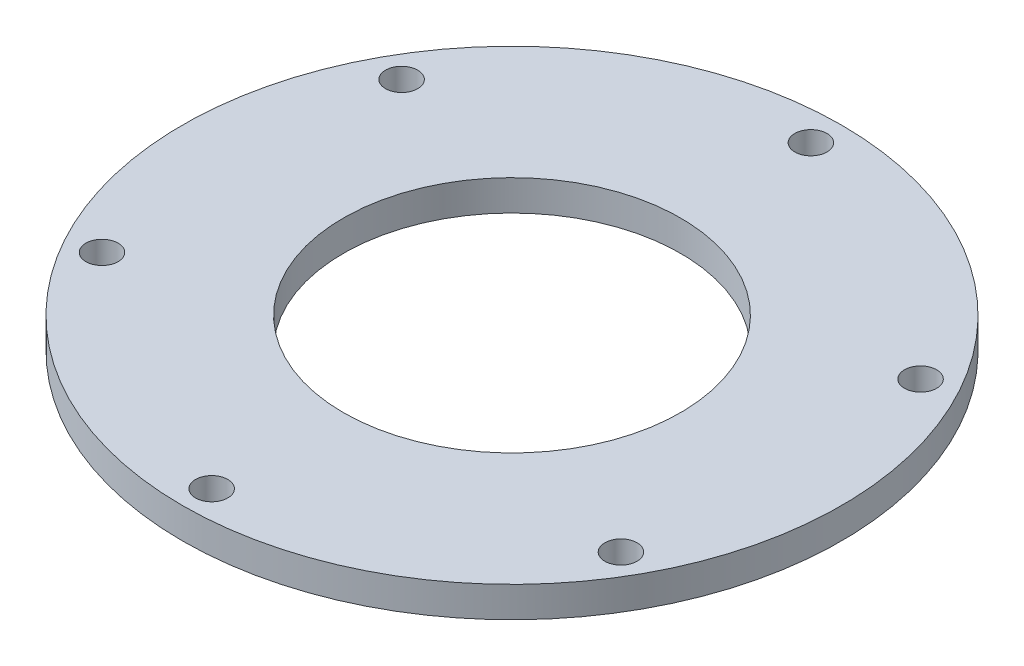
ISO-10303-21;
HEADER;
FILE_DESCRIPTION(('STEP AP214'),'2;1');
FILE_NAME('part.step','',(''),(''),'','','');
FILE_SCHEMA(('AUTOMOTIVE_DESIGN { 1 0 10303 214 1 1 1 1 }'));
ENDSEC;
DATA;
#1=APPLICATION_CONTEXT('core data for automotive mechanical design processes');
#2=APPLICATION_PROTOCOL_DEFINITION('international standard','automotive_design',2000,#1);
#3=PRODUCT_CONTEXT('',#1,'mechanical');
#4=PRODUCT('Part','Part','',(#3));
#5=PRODUCT_RELATED_PRODUCT_CATEGORY('part','',(#4));
#6=PRODUCT_DEFINITION_FORMATION('','',#4);
#7=PRODUCT_DEFINITION_CONTEXT('part definition',#1,'design');
#8=PRODUCT_DEFINITION('design','',#6,#7);
#9=PRODUCT_DEFINITION_SHAPE('','',#8);
#10=(LENGTH_UNIT() NAMED_UNIT(*) SI_UNIT(.MILLI.,.METRE.));
#11=(NAMED_UNIT(*) PLANE_ANGLE_UNIT() SI_UNIT($,.RADIAN.));
#12=(NAMED_UNIT(*) SI_UNIT($,.STERADIAN.) SOLID_ANGLE_UNIT());
#13=UNCERTAINTY_MEASURE_WITH_UNIT(LENGTH_MEASURE(1.E-05),#10,'distance_accuracy_value','');
#14=(GEOMETRIC_REPRESENTATION_CONTEXT(3) GLOBAL_UNCERTAINTY_ASSIGNED_CONTEXT((#13)) GLOBAL_UNIT_ASSIGNED_CONTEXT((#10,
#11,#12)) REPRESENTATION_CONTEXT('',''));
#15=CARTESIAN_POINT('',(0.,0.,0.));
#16=DIRECTION('',(0.,0.,1.));
#17=DIRECTION('',(1.,0.,0.));
#18=AXIS2_PLACEMENT_3D('',#15,#16,#17);
#19=CARTESIAN_POINT('',(0.,10.,0.));
#20=DIRECTION('',(0.,-1.,0.));
#21=DIRECTION('',(0.,0.,-1.));
#22=AXIS2_PLACEMENT_3D('',#19,#20,#21);
#23=CYLINDRICAL_SURFACE('',#22,107.5);
#24=CARTESIAN_POINT('',(0.,10.,0.));
#25=DIRECTION('',(0.,1.,0.));
#26=DIRECTION('',(0.,0.,1.));
#27=AXIS2_PLACEMENT_3D('',#24,#25,#26);
#28=CIRCLE('',#27,107.5);
#29=CARTESIAN_POINT('',(0.,10.,107.5));
#30=VERTEX_POINT('',#29);
#31=EDGE_CURVE('E10',#30,#30,#28,.T.);
#32=ORIENTED_EDGE('',*,*,#31,.F.);
#33=EDGE_LOOP('',(#32));
#34=FACE_BOUND('',#33,.T.);
#35=CARTESIAN_POINT('',(0.,0.,0.));
#36=DIRECTION('',(0.,1.,0.));
#37=DIRECTION('',(0.,0.,1.));
#38=AXIS2_PLACEMENT_3D('',#35,#36,#37);
#39=CIRCLE('',#38,107.5);
#40=CARTESIAN_POINT('',(0.,0.,107.5));
#41=VERTEX_POINT('',#40);
#42=EDGE_CURVE('E45',#41,#41,#39,.T.);
#43=ORIENTED_EDGE('',*,*,#42,.T.);
#44=EDGE_LOOP('',(#43));
#45=FACE_BOUND('',#44,.T.);
#46=ADVANCED_FACE('F37',(#34,#45),#23,.T.);
#47=CARTESIAN_POINT('',(0.,10.,0.));
#48=DIRECTION('',(0.,1.,0.));
#49=DIRECTION('',(0.,0.,1.));
#50=AXIS2_PLACEMENT_3D('',#47,#48,#49);
#51=PLANE('',#50);
#52=CARTESIAN_POINT('',(0.,10.,0.));
#53=DIRECTION('',(0.,1.,0.));
#54=DIRECTION('',(0.,0.,1.));
#55=AXIS2_PLACEMENT_3D('',#52,#53,#54);
#56=CIRCLE('',#55,55.);
#57=CARTESIAN_POINT('',(0.,10.,55.));
#58=VERTEX_POINT('',#57);
#59=EDGE_CURVE('E213',#58,#58,#56,.T.);
#60=ORIENTED_EDGE('',*,*,#59,.F.);
#61=EDGE_LOOP('',(#60));
#62=FACE_BOUND('',#61,.T.);
#63=CARTESIAN_POINT('',(84.6393478934333,10.,-48.6334497096926));
#64=DIRECTION('',(0.,1.,0.));
#65=DIRECTION('',(0.,0.,1.));
#66=AXIS2_PLACEMENT_3D('',#63,#64,#65);
#67=CIRCLE('',#66,5.24999999999999);
#68=CARTESIAN_POINT('',(84.6393478934333,10.,-43.3834497096926));
#69=VERTEX_POINT('',#68);
#70=EDGE_CURVE('E90',#69,#69,#67,.T.);
#71=ORIENTED_EDGE('',*,*,#70,.F.);
#72=EDGE_LOOP('',(#71));
#73=FACE_BOUND('',#72,.T.);
#74=CARTESIAN_POINT('',(84.6393478934343,10.,49.0996508709245));
#75=DIRECTION('',(0.,1.,0.));
#76=DIRECTION('',(0.,0.,1.));
#77=AXIS2_PLACEMENT_3D('',#74,#75,#76);
#78=CIRCLE('',#77,5.24999999999999);
#79=CARTESIAN_POINT('',(84.6393478934343,10.,54.3496508709244));
#80=VERTEX_POINT('',#79);
#81=EDGE_CURVE('E77',#80,#80,#78,.T.);
#82=ORIENTED_EDGE('',*,*,#81,.F.);
#83=EDGE_LOOP('',(#82));
#84=FACE_BOUND('',#83,.T.);
#85=CARTESIAN_POINT('',(0.,10.,97.9662011612337));
#86=DIRECTION('',(0.,1.,0.));
#87=DIRECTION('',(0.,0.,1.));
#88=AXIS2_PLACEMENT_3D('',#85,#86,#87);
#89=CIRCLE('',#88,5.25);
#90=CARTESIAN_POINT('',(0.,10.,103.216201161234));
#91=VERTEX_POINT('',#90);
#92=EDGE_CURVE('E73',#91,#91,#89,.T.);
#93=ORIENTED_EDGE('',*,*,#92,.F.);
#94=EDGE_LOOP('',(#93));
#95=FACE_BOUND('',#94,.T.);
#96=CARTESIAN_POINT('',(-84.6393478934336,10.,49.0996508709257));
#97=DIRECTION('',(0.,1.,0.));
#98=DIRECTION('',(0.,0.,1.));
#99=AXIS2_PLACEMENT_3D('',#96,#97,#98);
#100=CIRCLE('',#99,5.24999999999999);
#101=CARTESIAN_POINT('',(-84.6393478934336,10.,54.3496508709256));
#102=VERTEX_POINT('',#101);
#103=EDGE_CURVE('E69',#102,#102,#100,.T.);
#104=ORIENTED_EDGE('',*,*,#103,.F.);
#105=EDGE_LOOP('',(#104));
#106=FACE_BOUND('',#105,.T.);
#107=CARTESIAN_POINT('',(-84.6393478934339,10.,-48.6334497096914));
#108=DIRECTION('',(0.,1.,0.));
#109=DIRECTION('',(0.,0.,1.));
#110=AXIS2_PLACEMENT_3D('',#107,#108,#109);
#111=CIRCLE('',#110,5.24999999999999);
#112=CARTESIAN_POINT('',(-84.6393478934339,10.,-43.3834497096914));
#113=VERTEX_POINT('',#112);
#114=EDGE_CURVE('E64',#113,#113,#111,.T.);
#115=ORIENTED_EDGE('',*,*,#114,.F.);
#116=EDGE_LOOP('',(#115));
#117=FACE_BOUND('',#116,.T.);
#118=CARTESIAN_POINT('',(0.,10.,-97.5));
#119=DIRECTION('',(0.,1.,0.));
#120=DIRECTION('',(0.,0.,1.));
#121=AXIS2_PLACEMENT_3D('',#118,#119,#120);
#122=CIRCLE('',#121,5.25);
#123=CARTESIAN_POINT('',(0.,10.,-92.25));
#124=VERTEX_POINT('',#123);
#125=EDGE_CURVE('E54',#124,#124,#122,.T.);
#126=ORIENTED_EDGE('',*,*,#125,.F.);
#127=EDGE_LOOP('',(#126));
#128=FACE_BOUND('',#127,.T.);
#129=ORIENTED_EDGE('',*,*,#31,.T.);
#130=EDGE_LOOP('',(#129));
#131=FACE_BOUND('',#130,.T.);
#132=ADVANCED_FACE('F103',(#62,#73,#84,#95,#106,#117,#128,#131),#51,.T.);
#133=CARTESIAN_POINT('',(0.,0.,0.));
#134=DIRECTION('',(0.,1.,0.));
#135=DIRECTION('',(0.,0.,1.));
#136=AXIS2_PLACEMENT_3D('',#133,#134,#135);
#137=PLANE('',#136);
#138=CARTESIAN_POINT('',(0.,0.,0.));
#139=DIRECTION('',(0.,1.,0.));
#140=DIRECTION('',(0.,0.,1.));
#141=AXIS2_PLACEMENT_3D('',#138,#139,#140);
#142=CIRCLE('',#141,55.);
#143=CARTESIAN_POINT('',(0.,0.,55.));
#144=VERTEX_POINT('',#143);
#145=EDGE_CURVE('E210',#144,#144,#142,.T.);
#146=ORIENTED_EDGE('',*,*,#145,.T.);
#147=EDGE_LOOP('',(#146));
#148=FACE_BOUND('',#147,.T.);
#149=CARTESIAN_POINT('',(84.6393478934333,0.,-48.6334497096926));
#150=DIRECTION('',(0.,1.,0.));
#151=DIRECTION('',(0.,0.,1.));
#152=AXIS2_PLACEMENT_3D('',#149,#150,#151);
#153=CIRCLE('',#152,5.24999999999999);
#154=CARTESIAN_POINT('',(84.6393478934333,0.,-43.3834497096926));
#155=VERTEX_POINT('',#154);
#156=EDGE_CURVE('E40',#155,#155,#153,.T.);
#157=ORIENTED_EDGE('',*,*,#156,.T.);
#158=EDGE_LOOP('',(#157));
#159=FACE_BOUND('',#158,.T.);
#160=CARTESIAN_POINT('',(84.6393478934343,0.,49.0996508709245));
#161=DIRECTION('',(0.,1.,0.));
#162=DIRECTION('',(0.,0.,1.));
#163=AXIS2_PLACEMENT_3D('',#160,#161,#162);
#164=CIRCLE('',#163,5.24999999999999);
#165=CARTESIAN_POINT('',(84.6393478934343,0.,54.3496508709244));
#166=VERTEX_POINT('',#165);
#167=EDGE_CURVE('E74',#166,#166,#164,.T.);
#168=ORIENTED_EDGE('',*,*,#167,.T.);
#169=EDGE_LOOP('',(#168));
#170=FACE_BOUND('',#169,.T.);
#171=CARTESIAN_POINT('',(0.,0.,97.9662011612337));
#172=DIRECTION('',(0.,1.,0.));
#173=DIRECTION('',(0.,0.,1.));
#174=AXIS2_PLACEMENT_3D('',#171,#172,#173);
#175=CIRCLE('',#174,5.24999999999999);
#176=CARTESIAN_POINT('',(0.,0.,103.216201161234));
#177=VERTEX_POINT('',#176);
#178=EDGE_CURVE('E70',#177,#177,#175,.T.);
#179=ORIENTED_EDGE('',*,*,#178,.T.);
#180=EDGE_LOOP('',(#179));
#181=FACE_BOUND('',#180,.T.);
#182=CARTESIAN_POINT('',(-84.6393478934336,0.,49.0996508709257));
#183=DIRECTION('',(0.,1.,0.));
#184=DIRECTION('',(0.,0.,1.));
#185=AXIS2_PLACEMENT_3D('',#182,#183,#184);
#186=CIRCLE('',#185,5.24999999999999);
#187=CARTESIAN_POINT('',(-84.6393478934336,0.,54.3496508709256));
#188=VERTEX_POINT('',#187);
#189=EDGE_CURVE('E65',#188,#188,#186,.T.);
#190=ORIENTED_EDGE('',*,*,#189,.T.);
#191=EDGE_LOOP('',(#190));
#192=FACE_BOUND('',#191,.T.);
#193=CARTESIAN_POINT('',(-84.6393478934339,0.,-48.6334497096914));
#194=DIRECTION('',(0.,1.,0.));
#195=DIRECTION('',(0.,0.,1.));
#196=AXIS2_PLACEMENT_3D('',#193,#194,#195);
#197=CIRCLE('',#196,5.24999999999999);
#198=CARTESIAN_POINT('',(-84.6393478934339,0.,-43.3834497096914));
#199=VERTEX_POINT('',#198);
#200=EDGE_CURVE('E60',#199,#199,#197,.T.);
#201=ORIENTED_EDGE('',*,*,#200,.T.);
#202=EDGE_LOOP('',(#201));
#203=FACE_BOUND('',#202,.T.);
#204=CARTESIAN_POINT('',(0.,0.,-97.5));
#205=DIRECTION('',(0.,1.,0.));
#206=DIRECTION('',(0.,0.,1.));
#207=AXIS2_PLACEMENT_3D('',#204,#205,#206);
#208=CIRCLE('',#207,5.24999999999999);
#209=CARTESIAN_POINT('',(0.,0.,-92.25));
#210=VERTEX_POINT('',#209);
#211=EDGE_CURVE('E51',#210,#210,#208,.T.);
#212=ORIENTED_EDGE('',*,*,#211,.T.);
#213=EDGE_LOOP('',(#212));
#214=FACE_BOUND('',#213,.T.);
#215=ORIENTED_EDGE('',*,*,#42,.F.);
#216=EDGE_LOOP('',(#215));
#217=FACE_BOUND('',#216,.T.);
#218=ADVANCED_FACE('F106',(#148,#159,#170,#181,#192,#203,#214,#217),#137,.F.);
#219=CARTESIAN_POINT('',(0.,10.,-97.5));
#220=DIRECTION('',(0.,1.,0.));
#221=DIRECTION('',(0.,0.,1.));
#222=AXIS2_PLACEMENT_3D('',#219,#220,#221);
#223=CYLINDRICAL_SURFACE('',#222,5.24999999999999);
#224=ORIENTED_EDGE('',*,*,#125,.T.);
#225=EDGE_LOOP('',(#224));
#226=FACE_BOUND('',#225,.T.);
#227=ORIENTED_EDGE('',*,*,#211,.F.);
#228=EDGE_LOOP('',(#227));
#229=FACE_BOUND('',#228,.T.);
#230=ADVANCED_FACE('F113',(#226,#229),#223,.F.);
#231=CARTESIAN_POINT('',(-84.6393478934339,10.,-48.6334497096914));
#232=DIRECTION('',(0.,1.,0.));
#233=DIRECTION('',(0.,0.,1.));
#234=AXIS2_PLACEMENT_3D('',#231,#232,#233);
#235=CYLINDRICAL_SURFACE('',#234,5.24999999999999);
#236=ORIENTED_EDGE('',*,*,#114,.T.);
#237=EDGE_LOOP('',(#236));
#238=FACE_BOUND('',#237,.T.);
#239=ORIENTED_EDGE('',*,*,#200,.F.);
#240=EDGE_LOOP('',(#239));
#241=FACE_BOUND('',#240,.T.);
#242=ADVANCED_FACE('F100',(#238,#241),#235,.F.);
#243=CARTESIAN_POINT('',(-84.6393478934336,10.,49.0996508709257));
#244=DIRECTION('',(0.,1.,0.));
#245=DIRECTION('',(0.,0.,1.));
#246=AXIS2_PLACEMENT_3D('',#243,#244,#245);
#247=CYLINDRICAL_SURFACE('',#246,5.24999999999999);
#248=ORIENTED_EDGE('',*,*,#103,.T.);
#249=EDGE_LOOP('',(#248));
#250=FACE_BOUND('',#249,.T.);
#251=ORIENTED_EDGE('',*,*,#189,.F.);
#252=EDGE_LOOP('',(#251));
#253=FACE_BOUND('',#252,.T.);
#254=ADVANCED_FACE('F148',(#250,#253),#247,.F.);
#255=CARTESIAN_POINT('',(0.,10.,97.9662011612337));
#256=DIRECTION('',(0.,1.,0.));
#257=DIRECTION('',(0.,0.,1.));
#258=AXIS2_PLACEMENT_3D('',#255,#256,#257);
#259=CYLINDRICAL_SURFACE('',#258,5.24999999999999);
#260=ORIENTED_EDGE('',*,*,#92,.T.);
#261=EDGE_LOOP('',(#260));
#262=FACE_BOUND('',#261,.T.);
#263=ORIENTED_EDGE('',*,*,#178,.F.);
#264=EDGE_LOOP('',(#263));
#265=FACE_BOUND('',#264,.T.);
#266=ADVANCED_FACE('F155',(#262,#265),#259,.F.);
#267=CARTESIAN_POINT('',(84.6393478934343,10.,49.0996508709245));
#268=DIRECTION('',(0.,1.,0.));
#269=DIRECTION('',(0.,0.,1.));
#270=AXIS2_PLACEMENT_3D('',#267,#268,#269);
#271=CYLINDRICAL_SURFACE('',#270,5.24999999999999);
#272=ORIENTED_EDGE('',*,*,#81,.T.);
#273=EDGE_LOOP('',(#272));
#274=FACE_BOUND('',#273,.T.);
#275=ORIENTED_EDGE('',*,*,#167,.F.);
#276=EDGE_LOOP('',(#275));
#277=FACE_BOUND('',#276,.T.);
#278=ADVANCED_FACE('F163',(#274,#277),#271,.F.);
#279=CARTESIAN_POINT('',(84.6393478934333,10.,-48.6334497096926));
#280=DIRECTION('',(0.,1.,0.));
#281=DIRECTION('',(0.,0.,1.));
#282=AXIS2_PLACEMENT_3D('',#279,#280,#281);
#283=CYLINDRICAL_SURFACE('',#282,5.24999999999999);
#284=ORIENTED_EDGE('',*,*,#70,.T.);
#285=EDGE_LOOP('',(#284));
#286=FACE_BOUND('',#285,.T.);
#287=ORIENTED_EDGE('',*,*,#156,.F.);
#288=EDGE_LOOP('',(#287));
#289=FACE_BOUND('',#288,.T.);
#290=ADVANCED_FACE('F171',(#286,#289),#283,.F.);
#291=CARTESIAN_POINT('',(0.,0.,0.));
#292=DIRECTION('',(0.,1.,0.));
#293=DIRECTION('',(0.,0.,1.));
#294=AXIS2_PLACEMENT_3D('',#291,#292,#293);
#295=CYLINDRICAL_SURFACE('',#294,55.);
#296=ORIENTED_EDGE('',*,*,#145,.F.);
#297=EDGE_LOOP('',(#296));
#298=FACE_BOUND('',#297,.T.);
#299=ORIENTED_EDGE('',*,*,#59,.T.);
#300=EDGE_LOOP('',(#299));
#301=FACE_BOUND('',#300,.T.);
#302=ADVANCED_FACE('F177',(#298,#301),#295,.F.);
#303=CLOSED_SHELL('',(#46,#132,#218,#230,#242,#254,#266,#278,#290,#302));
#304=MANIFOLD_SOLID_BREP('B2',#303);
#305=ADVANCED_BREP_SHAPE_REPRESENTATION('',(#18,#304),#14);
#306=SHAPE_DEFINITION_REPRESENTATION(#9,#305);
ENDSEC;
END-ISO-10303-21;
